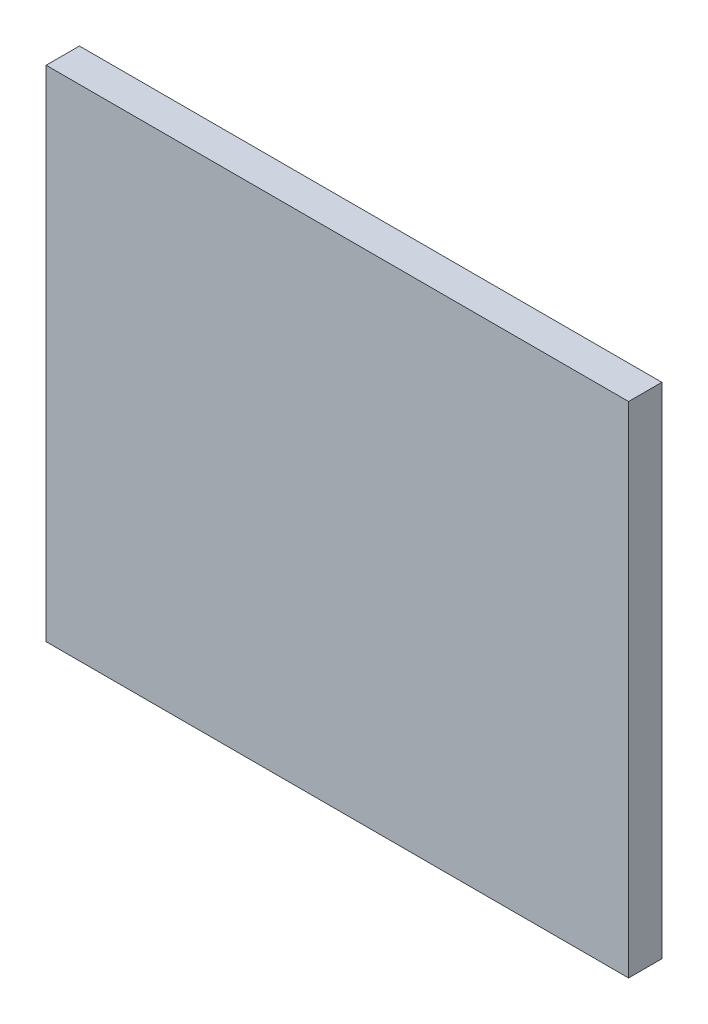
ISO-10303-21;
HEADER;
FILE_DESCRIPTION(('STEP AP214'),'2;1');
FILE_NAME('part.step','',(''),(''),'','','');
FILE_SCHEMA(('AUTOMOTIVE_DESIGN { 1 0 10303 214 1 1 1 1 }'));
ENDSEC;
DATA;
#1=APPLICATION_CONTEXT('core data for automotive mechanical design processes');
#2=APPLICATION_PROTOCOL_DEFINITION('international standard','automotive_design',2000,#1);
#3=PRODUCT_CONTEXT('',#1,'mechanical');
#4=PRODUCT('Part','Part','',(#3));
#5=PRODUCT_RELATED_PRODUCT_CATEGORY('part','',(#4));
#6=PRODUCT_DEFINITION_FORMATION('','',#4);
#7=PRODUCT_DEFINITION_CONTEXT('part definition',#1,'design');
#8=PRODUCT_DEFINITION('design','',#6,#7);
#9=PRODUCT_DEFINITION_SHAPE('','',#8);
#10=(LENGTH_UNIT() NAMED_UNIT(*) SI_UNIT(.MILLI.,.METRE.));
#11=(NAMED_UNIT(*) PLANE_ANGLE_UNIT() SI_UNIT($,.RADIAN.));
#12=(NAMED_UNIT(*) SI_UNIT($,.STERADIAN.) SOLID_ANGLE_UNIT());
#13=UNCERTAINTY_MEASURE_WITH_UNIT(LENGTH_MEASURE(1.E-05),#10,'distance_accuracy_value','');
#14=(GEOMETRIC_REPRESENTATION_CONTEXT(3) GLOBAL_UNCERTAINTY_ASSIGNED_CONTEXT((#13)) GLOBAL_UNIT_ASSIGNED_CONTEXT((#10,
#11,#12)) REPRESENTATION_CONTEXT('',''));
#15=CARTESIAN_POINT('',(0.,0.,0.));
#16=DIRECTION('',(0.,0.,1.));
#17=DIRECTION('',(1.,0.,0.));
#18=AXIS2_PLACEMENT_3D('',#15,#16,#17);
#19=CARTESIAN_POINT('',(0.,0.,4.));
#20=DIRECTION('',(1.,0.,0.));
#21=DIRECTION('',(0.,0.,-1.));
#22=AXIS2_PLACEMENT_3D('',#19,#20,#21);
#23=PLANE('',#22);
#24=DIRECTION('',(0.,-1.,0.));
#25=VECTOR('',#24,1.);
#26=CARTESIAN_POINT('',(0.,0.,0.));
#27=LINE('',#26,#25);
#28=CARTESIAN_POINT('',(0.,60.,0.));
#29=VERTEX_POINT('',#28);
#30=CARTESIAN_POINT('',(0.,0.,0.));
#31=VERTEX_POINT('',#30);
#32=EDGE_CURVE('E108',#29,#31,#27,.T.);
#33=ORIENTED_EDGE('',*,*,#32,.T.);
#34=DIRECTION('',(0.,0.,-1.));
#35=VECTOR('',#34,1.);
#36=CARTESIAN_POINT('',(0.,0.,4.));
#37=LINE('',#36,#35);
#38=CARTESIAN_POINT('',(0.,0.,4.));
#39=VERTEX_POINT('',#38);
#40=EDGE_CURVE('E11',#39,#31,#37,.T.);
#41=ORIENTED_EDGE('',*,*,#40,.F.);
#42=DIRECTION('',(0.,-1.,0.));
#43=VECTOR('',#42,1.);
#44=CARTESIAN_POINT('',(0.,0.,4.));
#45=LINE('',#44,#43);
#46=CARTESIAN_POINT('',(0.,60.,4.));
#47=VERTEX_POINT('',#46);
#48=EDGE_CURVE('E92',#47,#39,#45,.T.);
#49=ORIENTED_EDGE('',*,*,#48,.F.);
#50=DIRECTION('',(0.,0.,-1.));
#51=VECTOR('',#50,1.);
#52=CARTESIAN_POINT('',(0.,60.,4.));
#53=LINE('',#52,#51);
#54=EDGE_CURVE('E105',#47,#29,#53,.T.);
#55=ORIENTED_EDGE('',*,*,#54,.T.);
#56=EDGE_LOOP('',(#33,#41,#49,#55));
#57=FACE_BOUND('',#56,.T.);
#58=ADVANCED_FACE('F43',(#57),#23,.F.);
#59=CARTESIAN_POINT('',(0.,0.,4.));
#60=DIRECTION('',(0.,1.,0.));
#61=DIRECTION('',(0.,0.,1.));
#62=AXIS2_PLACEMENT_3D('',#59,#60,#61);
#63=PLANE('',#62);
#64=DIRECTION('',(1.,0.,0.));
#65=VECTOR('',#64,1.);
#66=CARTESIAN_POINT('',(0.,0.,0.));
#67=LINE('',#66,#65);
#68=CARTESIAN_POINT('',(70.,0.,0.));
#69=VERTEX_POINT('',#68);
#70=EDGE_CURVE('E97',#31,#69,#67,.T.);
#71=ORIENTED_EDGE('',*,*,#70,.T.);
#72=DIRECTION('',(0.,0.,-1.));
#73=VECTOR('',#72,1.);
#74=CARTESIAN_POINT('',(70.,0.,4.));
#75=LINE('',#74,#73);
#76=CARTESIAN_POINT('',(70.,0.,4.));
#77=VERTEX_POINT('',#76);
#78=EDGE_CURVE('E51',#77,#69,#75,.T.);
#79=ORIENTED_EDGE('',*,*,#78,.F.);
#80=DIRECTION('',(1.,0.,0.));
#81=VECTOR('',#80,1.);
#82=CARTESIAN_POINT('',(0.,0.,4.));
#83=LINE('',#82,#81);
#84=EDGE_CURVE('E87',#39,#77,#83,.T.);
#85=ORIENTED_EDGE('',*,*,#84,.F.);
#86=ORIENTED_EDGE('',*,*,#40,.T.);
#87=EDGE_LOOP('',(#71,#79,#85,#86));
#88=FACE_BOUND('',#87,.T.);
#89=ADVANCED_FACE('F100',(#88),#63,.F.);
#90=CARTESIAN_POINT('',(70.,0.,4.));
#91=DIRECTION('',(-1.,0.,0.));
#92=DIRECTION('',(0.,0.,1.));
#93=AXIS2_PLACEMENT_3D('',#90,#91,#92);
#94=PLANE('',#93);
#95=DIRECTION('',(0.,1.,0.));
#96=VECTOR('',#95,1.);
#97=CARTESIAN_POINT('',(70.,0.,0.));
#98=LINE('',#97,#96);
#99=CARTESIAN_POINT('',(70.,60.,0.));
#100=VERTEX_POINT('',#99);
#101=EDGE_CURVE('E78',#69,#100,#98,.T.);
#102=ORIENTED_EDGE('',*,*,#101,.T.);
#103=DIRECTION('',(0.,0.,-1.));
#104=VECTOR('',#103,1.);
#105=CARTESIAN_POINT('',(70.,60.,4.));
#106=LINE('',#105,#104);
#107=CARTESIAN_POINT('',(70.,60.,4.));
#108=VERTEX_POINT('',#107);
#109=EDGE_CURVE('E98',#108,#100,#106,.T.);
#110=ORIENTED_EDGE('',*,*,#109,.F.);
#111=DIRECTION('',(0.,1.,0.));
#112=VECTOR('',#111,1.);
#113=CARTESIAN_POINT('',(70.,0.,4.));
#114=LINE('',#113,#112);
#115=EDGE_CURVE('E95',#77,#108,#114,.T.);
#116=ORIENTED_EDGE('',*,*,#115,.F.);
#117=ORIENTED_EDGE('',*,*,#78,.T.);
#118=EDGE_LOOP('',(#102,#110,#116,#117));
#119=FACE_BOUND('',#118,.T.);
#120=ADVANCED_FACE('F99',(#119),#94,.F.);
#121=CARTESIAN_POINT('',(0.,60.,4.));
#122=DIRECTION('',(0.,-1.,0.));
#123=DIRECTION('',(0.,0.,-1.));
#124=AXIS2_PLACEMENT_3D('',#121,#122,#123);
#125=PLANE('',#124);
#126=DIRECTION('',(-1.,0.,0.));
#127=VECTOR('',#126,1.);
#128=CARTESIAN_POINT('',(0.,60.,0.));
#129=LINE('',#128,#127);
#130=EDGE_CURVE('E85',#100,#29,#129,.T.);
#131=ORIENTED_EDGE('',*,*,#130,.T.);
#132=ORIENTED_EDGE('',*,*,#54,.F.);
#133=DIRECTION('',(-1.,0.,0.));
#134=VECTOR('',#133,1.);
#135=CARTESIAN_POINT('',(0.,60.,4.));
#136=LINE('',#135,#134);
#137=EDGE_CURVE('E56',#108,#47,#136,.T.);
#138=ORIENTED_EDGE('',*,*,#137,.F.);
#139=ORIENTED_EDGE('',*,*,#109,.T.);
#140=EDGE_LOOP('',(#131,#132,#138,#139));
#141=FACE_BOUND('',#140,.T.);
#142=ADVANCED_FACE('F111',(#141),#125,.F.);
#143=CARTESIAN_POINT('',(0.,0.,4.));
#144=DIRECTION('',(0.,0.,-1.));
#145=DIRECTION('',(-1.,0.,0.));
#146=AXIS2_PLACEMENT_3D('',#143,#144,#145);
#147=PLANE('',#146);
#148=ORIENTED_EDGE('',*,*,#48,.T.);
#149=ORIENTED_EDGE('',*,*,#84,.T.);
#150=ORIENTED_EDGE('',*,*,#115,.T.);
#151=ORIENTED_EDGE('',*,*,#137,.T.);
#152=EDGE_LOOP('',(#148,#149,#150,#151));
#153=FACE_BOUND('',#152,.T.);
#154=ADVANCED_FACE('F89',(#153),#147,.F.);
#155=CARTESIAN_POINT('',(0.,0.,0.));
#156=DIRECTION('',(0.,0.,-1.));
#157=DIRECTION('',(-1.,0.,0.));
#158=AXIS2_PLACEMENT_3D('',#155,#156,#157);
#159=PLANE('',#158);
#160=ORIENTED_EDGE('',*,*,#32,.F.);
#161=ORIENTED_EDGE('',*,*,#130,.F.);
#162=ORIENTED_EDGE('',*,*,#101,.F.);
#163=ORIENTED_EDGE('',*,*,#70,.F.);
#164=EDGE_LOOP('',(#160,#161,#162,#163));
#165=FACE_BOUND('',#164,.T.);
#166=ADVANCED_FACE('F118',(#165),#159,.T.);
#167=CLOSED_SHELL('',(#58,#89,#120,#142,#154,#166));
#168=MANIFOLD_SOLID_BREP('B2',#167);
#169=ADVANCED_BREP_SHAPE_REPRESENTATION('',(#18,#168),#14);
#170=SHAPE_DEFINITION_REPRESENTATION(#9,#169);
ENDSEC;
END-ISO-10303-21;
